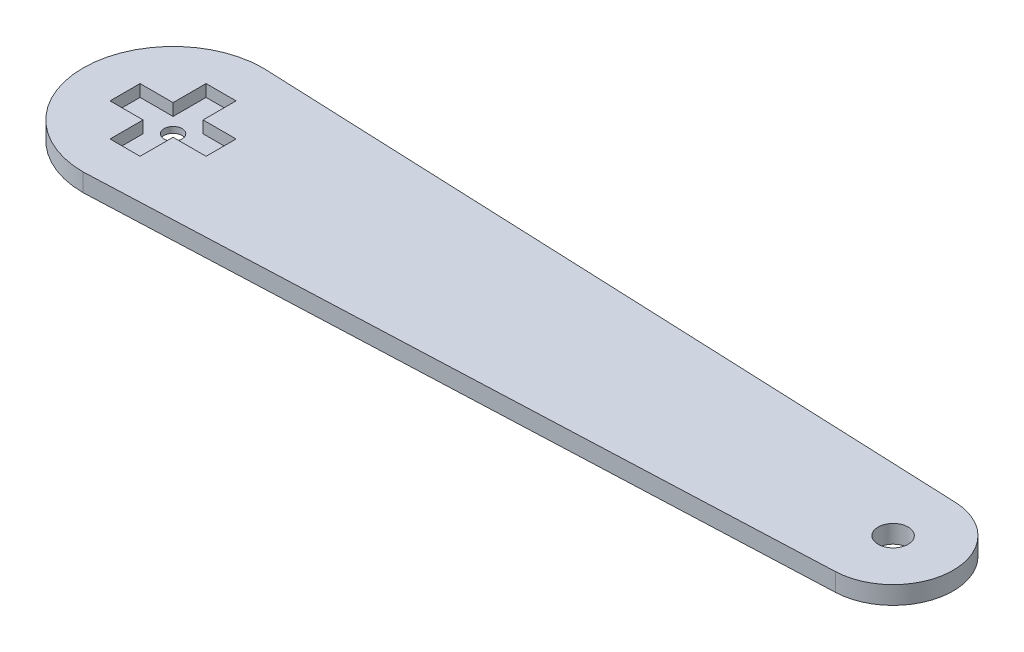
ISO-10303-21;
HEADER;
FILE_DESCRIPTION(('STEP AP214'),'2;1');
FILE_NAME('part.step','',(''),(''),'','','');
FILE_SCHEMA(('AUTOMOTIVE_DESIGN { 1 0 10303 214 1 1 1 1 }'));
ENDSEC;
DATA;
#1=APPLICATION_CONTEXT('core data for automotive mechanical design processes');
#2=APPLICATION_PROTOCOL_DEFINITION('international standard','automotive_design',2000,#1);
#3=PRODUCT_CONTEXT('',#1,'mechanical');
#4=PRODUCT('Part','Part','',(#3));
#5=PRODUCT_RELATED_PRODUCT_CATEGORY('part','',(#4));
#6=PRODUCT_DEFINITION_FORMATION('','',#4);
#7=PRODUCT_DEFINITION_CONTEXT('part definition',#1,'design');
#8=PRODUCT_DEFINITION('design','',#6,#7);
#9=PRODUCT_DEFINITION_SHAPE('','',#8);
#10=(LENGTH_UNIT() NAMED_UNIT(*) SI_UNIT(.MILLI.,.METRE.));
#11=(NAMED_UNIT(*) PLANE_ANGLE_UNIT() SI_UNIT($,.RADIAN.));
#12=(NAMED_UNIT(*) SI_UNIT($,.STERADIAN.) SOLID_ANGLE_UNIT());
#13=UNCERTAINTY_MEASURE_WITH_UNIT(LENGTH_MEASURE(1.E-05),#10,'distance_accuracy_value','');
#14=(GEOMETRIC_REPRESENTATION_CONTEXT(3) GLOBAL_UNCERTAINTY_ASSIGNED_CONTEXT((#13)) GLOBAL_UNIT_ASSIGNED_CONTEXT((#10,
#11,#12)) REPRESENTATION_CONTEXT('',''));
#15=CARTESIAN_POINT('',(0.,0.,0.));
#16=DIRECTION('',(0.,0.,1.));
#17=DIRECTION('',(1.,0.,0.));
#18=AXIS2_PLACEMENT_3D('',#15,#16,#17);
#19=CARTESIAN_POINT('',(0.,3.,0.));
#20=DIRECTION('',(0.,1.,0.));
#21=DIRECTION('',(0.,0.,1.));
#22=AXIS2_PLACEMENT_3D('',#19,#20,#21);
#23=PLANE('',#22);
#24=DIRECTION('',(0.999136065082581,0.,-0.0415586748019892));
#25=VECTOR('',#24,1.);
#26=CARTESIAN_POINT('',(0.622841562175591,3.,14.9740931482305));
#27=LINE('',#26,#25);
#28=CARTESIAN_POINT('',(0.,3.,15.));
#29=VERTEX_POINT('',#28);
#30=CARTESIAN_POINT('',(120.41558674802,3.,9.99136065082581));
#31=VERTEX_POINT('',#30);
#32=EDGE_CURVE('E324',#29,#31,#27,.T.);
#33=ORIENTED_EDGE('',*,*,#32,.T.);
#34=CARTESIAN_POINT('',(120.,3.,0.));
#35=DIRECTION('',(0.,1.,0.));
#36=DIRECTION('',(0.,0.,1.));
#37=AXIS2_PLACEMENT_3D('',#34,#35,#36);
#38=CIRCLE('',#37,10.);
#39=CARTESIAN_POINT('',(120.41558674802,3.,-9.99136065082581));
#40=VERTEX_POINT('',#39);
#41=EDGE_CURVE('E100',#31,#40,#38,.T.);
#42=ORIENTED_EDGE('',*,*,#41,.T.);
#43=DIRECTION('',(0.999136065082581,0.,0.0415586748019892));
#44=VECTOR('',#43,1.);
#45=CARTESIAN_POINT('',(0.622841562175591,3.,-14.9740931482305));
#46=LINE('',#45,#44);
#47=CARTESIAN_POINT('',(0.,3.,-15.));
#48=VERTEX_POINT('',#47);
#49=EDGE_CURVE('E329',#48,#40,#46,.T.);
#50=ORIENTED_EDGE('',*,*,#49,.F.);
#51=CARTESIAN_POINT('',(0.,3.,0.));
#52=DIRECTION('',(0.,1.,0.));
#53=DIRECTION('',(0.,0.,1.));
#54=AXIS2_PLACEMENT_3D('',#51,#52,#53);
#55=CIRCLE('',#54,15.);
#56=EDGE_CURVE('E72',#48,#29,#55,.T.);
#57=ORIENTED_EDGE('',*,*,#56,.T.);
#58=EDGE_LOOP('',(#33,#42,#50,#57));
#59=FACE_BOUND('',#58,.T.);
#60=CARTESIAN_POINT('',(120.,3.,0.));
#61=DIRECTION('',(0.,1.,0.));
#62=DIRECTION('',(0.,0.,1.));
#63=AXIS2_PLACEMENT_3D('',#60,#61,#62);
#64=CIRCLE('',#63,2.5);
#65=CARTESIAN_POINT('',(120.,3.,2.5));
#66=VERTEX_POINT('',#65);
#67=EDGE_CURVE('E315',#66,#66,#64,.T.);
#68=ORIENTED_EDGE('',*,*,#67,.F.);
#69=EDGE_LOOP('',(#68));
#70=FACE_BOUND('',#69,.T.);
#71=DIRECTION('',(1.,0.,0.));
#72=VECTOR('',#71,1.);
#73=CARTESIAN_POINT('',(0.,3.,-2.5));
#74=LINE('',#73,#72);
#75=CARTESIAN_POINT('',(-8.00000000000001,3.,-2.5));
#76=VERTEX_POINT('',#75);
#77=CARTESIAN_POINT('',(-2.50000000000001,3.,-2.5));
#78=VERTEX_POINT('',#77);
#79=EDGE_CURVE('E241',#76,#78,#74,.T.);
#80=ORIENTED_EDGE('',*,*,#79,.T.);
#81=DIRECTION('',(0.,0.,-1.));
#82=VECTOR('',#81,1.);
#83=CARTESIAN_POINT('',(-2.50000000000001,3.,0.));
#84=LINE('',#83,#82);
#85=CARTESIAN_POINT('',(-2.50000000000001,3.,-8.));
#86=VERTEX_POINT('',#85);
#87=EDGE_CURVE('E63',#78,#86,#84,.T.);
#88=ORIENTED_EDGE('',*,*,#87,.T.);
#89=DIRECTION('',(1.,0.,0.));
#90=VECTOR('',#89,1.);
#91=CARTESIAN_POINT('',(0.,3.,-8.));
#92=LINE('',#91,#90);
#93=CARTESIAN_POINT('',(2.49999999999999,3.,-8.));
#94=VERTEX_POINT('',#93);
#95=EDGE_CURVE('E196',#86,#94,#92,.T.);
#96=ORIENTED_EDGE('',*,*,#95,.T.);
#97=DIRECTION('',(0.,0.,-1.));
#98=VECTOR('',#97,1.);
#99=CARTESIAN_POINT('',(2.49999999999999,3.,0.));
#100=LINE('',#99,#98);
#101=CARTESIAN_POINT('',(2.49999999999999,3.,-2.5));
#102=VERTEX_POINT('',#101);
#103=EDGE_CURVE('E200',#102,#94,#100,.T.);
#104=ORIENTED_EDGE('',*,*,#103,.F.);
#105=DIRECTION('',(1.,0.,0.));
#106=VECTOR('',#105,1.);
#107=CARTESIAN_POINT('',(0.,3.,-2.5));
#108=LINE('',#107,#106);
#109=CARTESIAN_POINT('',(7.99999999999999,3.,-2.5));
#110=VERTEX_POINT('',#109);
#111=EDGE_CURVE('E272',#102,#110,#108,.T.);
#112=ORIENTED_EDGE('',*,*,#111,.T.);
#113=DIRECTION('',(0.,0.,-1.));
#114=VECTOR('',#113,1.);
#115=CARTESIAN_POINT('',(7.99999999999999,3.,0.));
#116=LINE('',#115,#114);
#117=CARTESIAN_POINT('',(7.99999999999999,3.,2.5));
#118=VERTEX_POINT('',#117);
#119=EDGE_CURVE('E268',#118,#110,#116,.T.);
#120=ORIENTED_EDGE('',*,*,#119,.F.);
#121=DIRECTION('',(1.,0.,0.));
#122=VECTOR('',#121,1.);
#123=CARTESIAN_POINT('',(0.,3.,2.5));
#124=LINE('',#123,#122);
#125=CARTESIAN_POINT('',(2.49999999999999,3.,2.5));
#126=VERTEX_POINT('',#125);
#127=EDGE_CURVE('E264',#126,#118,#124,.T.);
#128=ORIENTED_EDGE('',*,*,#127,.F.);
#129=DIRECTION('',(0.,0.,-1.));
#130=VECTOR('',#129,1.);
#131=CARTESIAN_POINT('',(2.49999999999999,3.,0.));
#132=LINE('',#131,#130);
#133=CARTESIAN_POINT('',(2.49999999999999,3.,8.));
#134=VERTEX_POINT('',#133);
#135=EDGE_CURVE('E260',#134,#126,#132,.T.);
#136=ORIENTED_EDGE('',*,*,#135,.F.);
#137=DIRECTION('',(1.,0.,0.));
#138=VECTOR('',#137,1.);
#139=CARTESIAN_POINT('',(0.,3.,8.));
#140=LINE('',#139,#138);
#141=CARTESIAN_POINT('',(-2.50000000000001,3.,8.));
#142=VERTEX_POINT('',#141);
#143=EDGE_CURVE('E256',#142,#134,#140,.T.);
#144=ORIENTED_EDGE('',*,*,#143,.F.);
#145=DIRECTION('',(0.,0.,-1.));
#146=VECTOR('',#145,1.);
#147=CARTESIAN_POINT('',(-2.50000000000001,3.,0.));
#148=LINE('',#147,#146);
#149=CARTESIAN_POINT('',(-2.50000000000001,3.,2.5));
#150=VERTEX_POINT('',#149);
#151=EDGE_CURVE('E252',#142,#150,#148,.T.);
#152=ORIENTED_EDGE('',*,*,#151,.T.);
#153=DIRECTION('',(1.,0.,0.));
#154=VECTOR('',#153,1.);
#155=CARTESIAN_POINT('',(0.,3.,2.5));
#156=LINE('',#155,#154);
#157=CARTESIAN_POINT('',(-8.00000000000001,3.,2.5));
#158=VERTEX_POINT('',#157);
#159=EDGE_CURVE('E248',#158,#150,#156,.T.);
#160=ORIENTED_EDGE('',*,*,#159,.F.);
#161=DIRECTION('',(0.,0.,-1.));
#162=VECTOR('',#161,1.);
#163=CARTESIAN_POINT('',(-8.00000000000001,3.,0.));
#164=LINE('',#163,#162);
#165=EDGE_CURVE('E244',#158,#76,#164,.T.);
#166=ORIENTED_EDGE('',*,*,#165,.T.);
#167=EDGE_LOOP('',(#80,#88,#96,#104,#112,#120,#128,#136,#144,#152,#160,#166));
#168=FACE_BOUND('',#167,.T.);
#169=ADVANCED_FACE('F47',(#59,#70,#168),#23,.T.);
#170=CARTESIAN_POINT('',(0.,0.,0.));
#171=DIRECTION('',(0.,1.,0.));
#172=DIRECTION('',(0.,0.,1.));
#173=AXIS2_PLACEMENT_3D('',#170,#171,#172);
#174=CYLINDRICAL_SURFACE('',#173,1.5);
#175=CARTESIAN_POINT('',(0.,0.,0.));
#176=DIRECTION('',(0.,1.,0.));
#177=DIRECTION('',(0.,0.,1.));
#178=AXIS2_PLACEMENT_3D('',#175,#176,#177);
#179=CIRCLE('',#178,1.5);
#180=CARTESIAN_POINT('',(0.,0.,1.5));
#181=VERTEX_POINT('',#180);
#182=EDGE_CURVE('E282',#181,#181,#179,.T.);
#183=ORIENTED_EDGE('',*,*,#182,.F.);
#184=EDGE_LOOP('',(#183));
#185=FACE_BOUND('',#184,.T.);
#186=CARTESIAN_POINT('',(0.,1.,0.));
#187=DIRECTION('',(0.,1.,0.));
#188=DIRECTION('',(0.,0.,1.));
#189=AXIS2_PLACEMENT_3D('',#186,#187,#188);
#190=CIRCLE('',#189,1.5);
#191=CARTESIAN_POINT('',(0.,1.,1.5));
#192=VERTEX_POINT('',#191);
#193=EDGE_CURVE('E189',#192,#192,#190,.F.);
#194=ORIENTED_EDGE('',*,*,#193,.F.);
#195=EDGE_LOOP('',(#194));
#196=FACE_BOUND('',#195,.T.);
#197=ADVANCED_FACE('F367',(#185,#196),#174,.F.);
#198=CARTESIAN_POINT('',(0.622841562175591,3.,14.9740931482305));
#199=DIRECTION('',(-0.0415586748019892,0.,-0.99913606508258));
#200=DIRECTION('',(-0.999136065082581,0.,0.0415586748019892));
#201=AXIS2_PLACEMENT_3D('',#198,#199,#200);
#202=PLANE('',#201);
#203=DIRECTION('',(0.999136065082581,0.,-0.0415586748019892));
#204=VECTOR('',#203,1.);
#205=CARTESIAN_POINT('',(0.622841562175591,0.,14.9740931482305));
#206=LINE('',#205,#204);
#207=CARTESIAN_POINT('',(0.,0.,15.));
#208=VERTEX_POINT('',#207);
#209=CARTESIAN_POINT('',(120.41558674802,0.,9.99136065082581));
#210=VERTEX_POINT('',#209);
#211=EDGE_CURVE('E320',#208,#210,#206,.T.);
#212=ORIENTED_EDGE('',*,*,#211,.T.);
#213=DIRECTION('',(0.,-1.,0.));
#214=VECTOR('',#213,1.);
#215=CARTESIAN_POINT('',(120.41558674802,3.,9.99136065082581));
#216=LINE('',#215,#214);
#217=EDGE_CURVE('E11',#31,#210,#216,.T.);
#218=ORIENTED_EDGE('',*,*,#217,.F.);
#219=ORIENTED_EDGE('',*,*,#32,.F.);
#220=DIRECTION('',(0.,-1.,0.));
#221=VECTOR('',#220,1.);
#222=CARTESIAN_POINT('',(0.,3.,15.));
#223=LINE('',#222,#221);
#224=EDGE_CURVE('E335',#29,#208,#223,.T.);
#225=ORIENTED_EDGE('',*,*,#224,.T.);
#226=EDGE_LOOP('',(#212,#218,#219,#225));
#227=FACE_BOUND('',#226,.T.);
#228=ADVANCED_FACE('F49',(#227),#202,.F.);
#229=CARTESIAN_POINT('',(120.,3.,0.));
#230=DIRECTION('',(0.,-1.,0.));
#231=DIRECTION('',(0.,0.,-1.));
#232=AXIS2_PLACEMENT_3D('',#229,#230,#231);
#233=CYLINDRICAL_SURFACE('',#232,10.);
#234=CARTESIAN_POINT('',(120.,0.,0.));
#235=DIRECTION('',(0.,1.,0.));
#236=DIRECTION('',(0.,0.,1.));
#237=AXIS2_PLACEMENT_3D('',#234,#235,#236);
#238=CIRCLE('',#237,10.);
#239=CARTESIAN_POINT('',(120.41558674802,0.,-9.99136065082581));
#240=VERTEX_POINT('',#239);
#241=EDGE_CURVE('E339',#210,#240,#238,.T.);
#242=ORIENTED_EDGE('',*,*,#241,.T.);
#243=DIRECTION('',(0.,-1.,0.));
#244=VECTOR('',#243,1.);
#245=CARTESIAN_POINT('',(120.41558674802,3.,-9.99136065082581));
#246=LINE('',#245,#244);
#247=EDGE_CURVE('E56',#40,#240,#246,.T.);
#248=ORIENTED_EDGE('',*,*,#247,.F.);
#249=ORIENTED_EDGE('',*,*,#41,.F.);
#250=ORIENTED_EDGE('',*,*,#217,.T.);
#251=EDGE_LOOP('',(#242,#248,#249,#250));
#252=FACE_BOUND('',#251,.T.);
#253=ADVANCED_FACE('F357',(#252),#233,.T.);
#254=CARTESIAN_POINT('',(0.622841562175591,3.,-14.9740931482305));
#255=DIRECTION('',(0.0415586748019892,0.,-0.99913606508258));
#256=DIRECTION('',(-0.999136065082581,0.,-0.0415586748019892));
#257=AXIS2_PLACEMENT_3D('',#254,#255,#256);
#258=PLANE('',#257);
#259=DIRECTION('',(0.999136065082581,0.,0.0415586748019892));
#260=VECTOR('',#259,1.);
#261=CARTESIAN_POINT('',(0.622841562175591,0.,-14.9740931482305));
#262=LINE('',#261,#260);
#263=CARTESIAN_POINT('',(0.,0.,-15.));
#264=VERTEX_POINT('',#263);
#265=EDGE_CURVE('E343',#264,#240,#262,.T.);
#266=ORIENTED_EDGE('',*,*,#265,.F.);
#267=DIRECTION('',(0.,-1.,0.));
#268=VECTOR('',#267,1.);
#269=CARTESIAN_POINT('',(0.,3.,-15.));
#270=LINE('',#269,#268);
#271=EDGE_CURVE('E351',#48,#264,#270,.T.);
#272=ORIENTED_EDGE('',*,*,#271,.F.);
#273=ORIENTED_EDGE('',*,*,#49,.T.);
#274=ORIENTED_EDGE('',*,*,#247,.T.);
#275=EDGE_LOOP('',(#266,#272,#273,#274));
#276=FACE_BOUND('',#275,.T.);
#277=ADVANCED_FACE('F356',(#276),#258,.T.);
#278=CARTESIAN_POINT('',(0.,3.,0.));
#279=DIRECTION('',(0.,-1.,0.));
#280=DIRECTION('',(0.,0.,-1.));
#281=AXIS2_PLACEMENT_3D('',#278,#279,#280);
#282=CYLINDRICAL_SURFACE('',#281,15.);
#283=CARTESIAN_POINT('',(0.,0.,0.));
#284=DIRECTION('',(0.,1.,0.));
#285=DIRECTION('',(0.,0.,1.));
#286=AXIS2_PLACEMENT_3D('',#283,#284,#285);
#287=CIRCLE('',#286,15.);
#288=EDGE_CURVE('E93',#264,#208,#287,.T.);
#289=ORIENTED_EDGE('',*,*,#288,.T.);
#290=ORIENTED_EDGE('',*,*,#224,.F.);
#291=ORIENTED_EDGE('',*,*,#56,.F.);
#292=ORIENTED_EDGE('',*,*,#271,.T.);
#293=EDGE_LOOP('',(#289,#290,#291,#292));
#294=FACE_BOUND('',#293,.T.);
#295=ADVANCED_FACE('F364',(#294),#282,.T.);
#296=CARTESIAN_POINT('',(0.,0.,0.));
#297=DIRECTION('',(0.,1.,0.));
#298=DIRECTION('',(0.,0.,1.));
#299=AXIS2_PLACEMENT_3D('',#296,#297,#298);
#300=PLANE('',#299);
#301=ORIENTED_EDGE('',*,*,#182,.T.);
#302=EDGE_LOOP('',(#301));
#303=FACE_BOUND('',#302,.T.);
#304=CARTESIAN_POINT('',(120.,0.,0.));
#305=DIRECTION('',(0.,1.,0.));
#306=DIRECTION('',(0.,0.,1.));
#307=AXIS2_PLACEMENT_3D('',#304,#305,#306);
#308=CIRCLE('',#307,2.5);
#309=CARTESIAN_POINT('',(120.,0.,2.5));
#310=VERTEX_POINT('',#309);
#311=EDGE_CURVE('E316',#310,#310,#308,.T.);
#312=ORIENTED_EDGE('',*,*,#311,.T.);
#313=EDGE_LOOP('',(#312));
#314=FACE_BOUND('',#313,.T.);
#315=ORIENTED_EDGE('',*,*,#211,.F.);
#316=ORIENTED_EDGE('',*,*,#288,.F.);
#317=ORIENTED_EDGE('',*,*,#265,.T.);
#318=ORIENTED_EDGE('',*,*,#241,.F.);
#319=EDGE_LOOP('',(#315,#316,#317,#318));
#320=FACE_BOUND('',#319,.T.);
#321=ADVANCED_FACE('F361',(#303,#314,#320),#300,.F.);
#322=CARTESIAN_POINT('',(120.,0.,0.));
#323=DIRECTION('',(0.,1.,0.));
#324=DIRECTION('',(0.,0.,1.));
#325=AXIS2_PLACEMENT_3D('',#322,#323,#324);
#326=CYLINDRICAL_SURFACE('',#325,2.5);
#327=ORIENTED_EDGE('',*,*,#311,.F.);
#328=EDGE_LOOP('',(#327));
#329=FACE_BOUND('',#328,.T.);
#330=ORIENTED_EDGE('',*,*,#67,.T.);
#331=EDGE_LOOP('',(#330));
#332=FACE_BOUND('',#331,.T.);
#333=ADVANCED_FACE('F418',(#329,#332),#326,.F.);
#334=CARTESIAN_POINT('',(-2.50000000000001,1.,0.));
#335=DIRECTION('',(1.,0.,0.));
#336=DIRECTION('',(0.,0.,-1.));
#337=AXIS2_PLACEMENT_3D('',#334,#335,#336);
#338=PLANE('',#337);
#339=ORIENTED_EDGE('',*,*,#87,.F.);
#340=DIRECTION('',(0.,1.,0.));
#341=VECTOR('',#340,1.);
#342=CARTESIAN_POINT('',(-2.50000000000001,1.,-2.5));
#343=LINE('',#342,#341);
#344=CARTESIAN_POINT('',(-2.50000000000001,1.,-2.5));
#345=VERTEX_POINT('',#344);
#346=EDGE_CURVE('E175',#345,#78,#343,.T.);
#347=ORIENTED_EDGE('',*,*,#346,.F.);
#348=DIRECTION('',(0.,0.,-1.));
#349=VECTOR('',#348,1.);
#350=CARTESIAN_POINT('',(-2.50000000000001,1.,0.));
#351=LINE('',#350,#349);
#352=CARTESIAN_POINT('',(-2.50000000000001,1.,-8.));
#353=VERTEX_POINT('',#352);
#354=EDGE_CURVE('E183',#345,#353,#351,.T.);
#355=ORIENTED_EDGE('',*,*,#354,.T.);
#356=DIRECTION('',(0.,1.,0.));
#357=VECTOR('',#356,1.);
#358=CARTESIAN_POINT('',(-2.50000000000001,1.,-8.));
#359=LINE('',#358,#357);
#360=EDGE_CURVE('E279',#353,#86,#359,.T.);
#361=ORIENTED_EDGE('',*,*,#360,.T.);
#362=EDGE_LOOP('',(#339,#347,#355,#361));
#363=FACE_BOUND('',#362,.T.);
#364=ADVANCED_FACE('F186',(#363),#338,.T.);
#365=CARTESIAN_POINT('',(0.,1.,-8.));
#366=DIRECTION('',(0.,0.,1.));
#367=DIRECTION('',(1.,0.,0.));
#368=AXIS2_PLACEMENT_3D('',#365,#366,#367);
#369=PLANE('',#368);
#370=ORIENTED_EDGE('',*,*,#95,.F.);
#371=ORIENTED_EDGE('',*,*,#360,.F.);
#372=DIRECTION('',(1.,0.,0.));
#373=VECTOR('',#372,1.);
#374=CARTESIAN_POINT('',(0.,1.,-8.));
#375=LINE('',#374,#373);
#376=CARTESIAN_POINT('',(2.49999999999999,1.,-8.));
#377=VERTEX_POINT('',#376);
#378=EDGE_CURVE('E194',#353,#377,#375,.T.);
#379=ORIENTED_EDGE('',*,*,#378,.T.);
#380=DIRECTION('',(0.,1.,0.));
#381=VECTOR('',#380,1.);
#382=CARTESIAN_POINT('',(2.49999999999999,1.,-8.));
#383=LINE('',#382,#381);
#384=EDGE_CURVE('E283',#377,#94,#383,.T.);
#385=ORIENTED_EDGE('',*,*,#384,.T.);
#386=EDGE_LOOP('',(#370,#371,#379,#385));
#387=FACE_BOUND('',#386,.T.);
#388=ADVANCED_FACE('F410',(#387),#369,.T.);
#389=CARTESIAN_POINT('',(2.49999999999999,1.,0.));
#390=DIRECTION('',(1.,0.,0.));
#391=DIRECTION('',(0.,0.,-1.));
#392=AXIS2_PLACEMENT_3D('',#389,#390,#391);
#393=PLANE('',#392);
#394=ORIENTED_EDGE('',*,*,#103,.T.);
#395=ORIENTED_EDGE('',*,*,#384,.F.);
#396=DIRECTION('',(0.,0.,-1.));
#397=VECTOR('',#396,1.);
#398=CARTESIAN_POINT('',(2.49999999999999,1.,0.));
#399=LINE('',#398,#397);
#400=CARTESIAN_POINT('',(2.49999999999999,1.,-2.5));
#401=VERTEX_POINT('',#400);
#402=EDGE_CURVE('E231',#401,#377,#399,.T.);
#403=ORIENTED_EDGE('',*,*,#402,.F.);
#404=DIRECTION('',(0.,1.,0.));
#405=VECTOR('',#404,1.);
#406=CARTESIAN_POINT('',(2.49999999999999,1.,-2.5));
#407=LINE('',#406,#405);
#408=EDGE_CURVE('E286',#401,#102,#407,.T.);
#409=ORIENTED_EDGE('',*,*,#408,.T.);
#410=EDGE_LOOP('',(#394,#395,#403,#409));
#411=FACE_BOUND('',#410,.T.);
#412=ADVANCED_FACE('F408',(#411),#393,.F.);
#413=CARTESIAN_POINT('',(0.,1.,-2.5));
#414=DIRECTION('',(0.,0.,1.));
#415=DIRECTION('',(1.,0.,0.));
#416=AXIS2_PLACEMENT_3D('',#413,#414,#415);
#417=PLANE('',#416);
#418=ORIENTED_EDGE('',*,*,#111,.F.);
#419=ORIENTED_EDGE('',*,*,#408,.F.);
#420=DIRECTION('',(1.,0.,0.));
#421=VECTOR('',#420,1.);
#422=CARTESIAN_POINT('',(0.,1.,-2.5));
#423=LINE('',#422,#421);
#424=CARTESIAN_POINT('',(7.99999999999999,1.,-2.5));
#425=VERTEX_POINT('',#424);
#426=EDGE_CURVE('E228',#401,#425,#423,.T.);
#427=ORIENTED_EDGE('',*,*,#426,.T.);
#428=DIRECTION('',(0.,1.,0.));
#429=VECTOR('',#428,1.);
#430=CARTESIAN_POINT('',(7.99999999999999,1.,-2.5));
#431=LINE('',#430,#429);
#432=EDGE_CURVE('E289',#425,#110,#431,.T.);
#433=ORIENTED_EDGE('',*,*,#432,.T.);
#434=EDGE_LOOP('',(#418,#419,#427,#433));
#435=FACE_BOUND('',#434,.T.);
#436=ADVANCED_FACE('F403',(#435),#417,.T.);
#437=CARTESIAN_POINT('',(7.99999999999999,1.,0.));
#438=DIRECTION('',(1.,0.,0.));
#439=DIRECTION('',(0.,0.,-1.));
#440=AXIS2_PLACEMENT_3D('',#437,#438,#439);
#441=PLANE('',#440);
#442=ORIENTED_EDGE('',*,*,#119,.T.);
#443=ORIENTED_EDGE('',*,*,#432,.F.);
#444=DIRECTION('',(0.,0.,-1.));
#445=VECTOR('',#444,1.);
#446=CARTESIAN_POINT('',(7.99999999999999,1.,0.));
#447=LINE('',#446,#445);
#448=CARTESIAN_POINT('',(7.99999999999999,1.,2.5));
#449=VERTEX_POINT('',#448);
#450=EDGE_CURVE('E224',#449,#425,#447,.T.);
#451=ORIENTED_EDGE('',*,*,#450,.F.);
#452=DIRECTION('',(0.,1.,0.));
#453=VECTOR('',#452,1.);
#454=CARTESIAN_POINT('',(7.99999999999999,1.,2.5));
#455=LINE('',#454,#453);
#456=EDGE_CURVE('E292',#449,#118,#455,.T.);
#457=ORIENTED_EDGE('',*,*,#456,.T.);
#458=EDGE_LOOP('',(#442,#443,#451,#457));
#459=FACE_BOUND('',#458,.T.);
#460=ADVANCED_FACE('F400',(#459),#441,.F.);
#461=CARTESIAN_POINT('',(0.,1.,2.5));
#462=DIRECTION('',(0.,0.,1.));
#463=DIRECTION('',(1.,0.,0.));
#464=AXIS2_PLACEMENT_3D('',#461,#462,#463);
#465=PLANE('',#464);
#466=ORIENTED_EDGE('',*,*,#127,.T.);
#467=ORIENTED_EDGE('',*,*,#456,.F.);
#468=DIRECTION('',(1.,0.,0.));
#469=VECTOR('',#468,1.);
#470=CARTESIAN_POINT('',(0.,1.,2.5));
#471=LINE('',#470,#469);
#472=CARTESIAN_POINT('',(2.49999999999999,1.,2.5));
#473=VERTEX_POINT('',#472);
#474=EDGE_CURVE('E220',#473,#449,#471,.T.);
#475=ORIENTED_EDGE('',*,*,#474,.F.);
#476=DIRECTION('',(0.,1.,0.));
#477=VECTOR('',#476,1.);
#478=CARTESIAN_POINT('',(2.49999999999999,1.,2.5));
#479=LINE('',#478,#477);
#480=EDGE_CURVE('E295',#473,#126,#479,.T.);
#481=ORIENTED_EDGE('',*,*,#480,.T.);
#482=EDGE_LOOP('',(#466,#467,#475,#481));
#483=FACE_BOUND('',#482,.T.);
#484=ADVANCED_FACE('F395',(#483),#465,.F.);
#485=CARTESIAN_POINT('',(2.49999999999999,1.,0.));
#486=DIRECTION('',(1.,0.,0.));
#487=DIRECTION('',(0.,0.,-1.));
#488=AXIS2_PLACEMENT_3D('',#485,#486,#487);
#489=PLANE('',#488);
#490=ORIENTED_EDGE('',*,*,#135,.T.);
#491=ORIENTED_EDGE('',*,*,#480,.F.);
#492=DIRECTION('',(0.,0.,-1.));
#493=VECTOR('',#492,1.);
#494=CARTESIAN_POINT('',(2.49999999999999,1.,0.));
#495=LINE('',#494,#493);
#496=CARTESIAN_POINT('',(2.49999999999999,1.,8.));
#497=VERTEX_POINT('',#496);
#498=EDGE_CURVE('E216',#497,#473,#495,.T.);
#499=ORIENTED_EDGE('',*,*,#498,.F.);
#500=DIRECTION('',(0.,1.,0.));
#501=VECTOR('',#500,1.);
#502=CARTESIAN_POINT('',(2.49999999999999,1.,8.));
#503=LINE('',#502,#501);
#504=EDGE_CURVE('E298',#497,#134,#503,.T.);
#505=ORIENTED_EDGE('',*,*,#504,.T.);
#506=EDGE_LOOP('',(#490,#491,#499,#505));
#507=FACE_BOUND('',#506,.T.);
#508=ADVANCED_FACE('F390',(#507),#489,.F.);
#509=CARTESIAN_POINT('',(0.,1.,8.));
#510=DIRECTION('',(0.,0.,1.));
#511=DIRECTION('',(1.,0.,0.));
#512=AXIS2_PLACEMENT_3D('',#509,#510,#511);
#513=PLANE('',#512);
#514=ORIENTED_EDGE('',*,*,#143,.T.);
#515=ORIENTED_EDGE('',*,*,#504,.F.);
#516=DIRECTION('',(1.,0.,0.));
#517=VECTOR('',#516,1.);
#518=CARTESIAN_POINT('',(0.,1.,8.));
#519=LINE('',#518,#517);
#520=CARTESIAN_POINT('',(-2.50000000000001,1.,8.));
#521=VERTEX_POINT('',#520);
#522=EDGE_CURVE('E212',#521,#497,#519,.T.);
#523=ORIENTED_EDGE('',*,*,#522,.F.);
#524=DIRECTION('',(0.,1.,0.));
#525=VECTOR('',#524,1.);
#526=CARTESIAN_POINT('',(-2.50000000000001,1.,8.));
#527=LINE('',#526,#525);
#528=EDGE_CURVE('E301',#521,#142,#527,.T.);
#529=ORIENTED_EDGE('',*,*,#528,.T.);
#530=EDGE_LOOP('',(#514,#515,#523,#529));
#531=FACE_BOUND('',#530,.T.);
#532=ADVANCED_FACE('F386',(#531),#513,.F.);
#533=CARTESIAN_POINT('',(-2.50000000000001,1.,0.));
#534=DIRECTION('',(1.,0.,0.));
#535=DIRECTION('',(0.,0.,-1.));
#536=AXIS2_PLACEMENT_3D('',#533,#534,#535);
#537=PLANE('',#536);
#538=ORIENTED_EDGE('',*,*,#151,.F.);
#539=ORIENTED_EDGE('',*,*,#528,.F.);
#540=DIRECTION('',(0.,0.,-1.));
#541=VECTOR('',#540,1.);
#542=CARTESIAN_POINT('',(-2.50000000000001,1.,0.));
#543=LINE('',#542,#541);
#544=CARTESIAN_POINT('',(-2.50000000000001,1.,2.5));
#545=VERTEX_POINT('',#544);
#546=EDGE_CURVE('E209',#521,#545,#543,.T.);
#547=ORIENTED_EDGE('',*,*,#546,.T.);
#548=DIRECTION('',(0.,1.,0.));
#549=VECTOR('',#548,1.);
#550=CARTESIAN_POINT('',(-2.50000000000001,1.,2.5));
#551=LINE('',#550,#549);
#552=EDGE_CURVE('E304',#545,#150,#551,.T.);
#553=ORIENTED_EDGE('',*,*,#552,.T.);
#554=EDGE_LOOP('',(#538,#539,#547,#553));
#555=FACE_BOUND('',#554,.T.);
#556=ADVANCED_FACE('F382',(#555),#537,.T.);
#557=CARTESIAN_POINT('',(0.,1.,2.5));
#558=DIRECTION('',(0.,0.,1.));
#559=DIRECTION('',(1.,0.,0.));
#560=AXIS2_PLACEMENT_3D('',#557,#558,#559);
#561=PLANE('',#560);
#562=ORIENTED_EDGE('',*,*,#159,.T.);
#563=ORIENTED_EDGE('',*,*,#552,.F.);
#564=DIRECTION('',(1.,0.,0.));
#565=VECTOR('',#564,1.);
#566=CARTESIAN_POINT('',(0.,1.,2.5));
#567=LINE('',#566,#565);
#568=CARTESIAN_POINT('',(-8.00000000000001,1.,2.5));
#569=VERTEX_POINT('',#568);
#570=EDGE_CURVE('E205',#569,#545,#567,.T.);
#571=ORIENTED_EDGE('',*,*,#570,.F.);
#572=DIRECTION('',(0.,1.,0.));
#573=VECTOR('',#572,1.);
#574=CARTESIAN_POINT('',(-8.00000000000001,1.,2.5));
#575=LINE('',#574,#573);
#576=EDGE_CURVE('E307',#569,#158,#575,.T.);
#577=ORIENTED_EDGE('',*,*,#576,.T.);
#578=EDGE_LOOP('',(#562,#563,#571,#577));
#579=FACE_BOUND('',#578,.T.);
#580=ADVANCED_FACE('F379',(#579),#561,.F.);
#581=CARTESIAN_POINT('',(-8.00000000000001,1.,0.));
#582=DIRECTION('',(1.,0.,0.));
#583=DIRECTION('',(0.,0.,-1.));
#584=AXIS2_PLACEMENT_3D('',#581,#582,#583);
#585=PLANE('',#584);
#586=ORIENTED_EDGE('',*,*,#165,.F.);
#587=ORIENTED_EDGE('',*,*,#576,.F.);
#588=DIRECTION('',(0.,0.,-1.));
#589=VECTOR('',#588,1.);
#590=CARTESIAN_POINT('',(-8.00000000000001,1.,0.));
#591=LINE('',#590,#589);
#592=CARTESIAN_POINT('',(-8.00000000000001,1.,-2.5));
#593=VERTEX_POINT('',#592);
#594=EDGE_CURVE('E182',#569,#593,#591,.T.);
#595=ORIENTED_EDGE('',*,*,#594,.T.);
#596=DIRECTION('',(0.,1.,0.));
#597=VECTOR('',#596,1.);
#598=CARTESIAN_POINT('',(-8.00000000000001,1.,-2.5));
#599=LINE('',#598,#597);
#600=EDGE_CURVE('E177',#593,#76,#599,.T.);
#601=ORIENTED_EDGE('',*,*,#600,.T.);
#602=EDGE_LOOP('',(#586,#587,#595,#601));
#603=FACE_BOUND('',#602,.T.);
#604=ADVANCED_FACE('F374',(#603),#585,.T.);
#605=CARTESIAN_POINT('',(0.,1.,-2.5));
#606=DIRECTION('',(0.,0.,1.));
#607=DIRECTION('',(1.,0.,0.));
#608=AXIS2_PLACEMENT_3D('',#605,#606,#607);
#609=PLANE('',#608);
#610=ORIENTED_EDGE('',*,*,#79,.F.);
#611=ORIENTED_EDGE('',*,*,#600,.F.);
#612=DIRECTION('',(1.,0.,0.));
#613=VECTOR('',#612,1.);
#614=CARTESIAN_POINT('',(0.,1.,-2.5));
#615=LINE('',#614,#613);
#616=EDGE_CURVE('E172',#593,#345,#615,.T.);
#617=ORIENTED_EDGE('',*,*,#616,.T.);
#618=ORIENTED_EDGE('',*,*,#346,.T.);
#619=EDGE_LOOP('',(#610,#611,#617,#618));
#620=FACE_BOUND('',#619,.T.);
#621=ADVANCED_FACE('F174',(#620),#609,.T.);
#622=CARTESIAN_POINT('',(0.,1.,0.));
#623=DIRECTION('',(0.,1.,0.));
#624=DIRECTION('',(0.,0.,1.));
#625=AXIS2_PLACEMENT_3D('',#622,#623,#624);
#626=PLANE('',#625);
#627=ORIENTED_EDGE('',*,*,#354,.F.);
#628=ORIENTED_EDGE('',*,*,#616,.F.);
#629=ORIENTED_EDGE('',*,*,#594,.F.);
#630=ORIENTED_EDGE('',*,*,#570,.T.);
#631=ORIENTED_EDGE('',*,*,#546,.F.);
#632=ORIENTED_EDGE('',*,*,#522,.T.);
#633=ORIENTED_EDGE('',*,*,#498,.T.);
#634=ORIENTED_EDGE('',*,*,#474,.T.);
#635=ORIENTED_EDGE('',*,*,#450,.T.);
#636=ORIENTED_EDGE('',*,*,#426,.F.);
#637=ORIENTED_EDGE('',*,*,#402,.T.);
#638=ORIENTED_EDGE('',*,*,#378,.F.);
#639=EDGE_LOOP('',(#627,#628,#629,#630,#631,#632,#633,#634,#635,#636,#637,#638));
#640=FACE_BOUND('',#639,.T.);
#641=ORIENTED_EDGE('',*,*,#193,.T.);
#642=EDGE_LOOP('',(#641));
#643=FACE_BOUND('',#642,.T.);
#644=ADVANCED_FACE('F191',(#640,#643),#626,.T.);
#645=CLOSED_SHELL('',(#169,#197,#228,#253,#277,#295,#321,#333,#364,#388,#412,#436,#460,#484,
#508,#532,#556,#580,#604,#621,#644));
#646=MANIFOLD_SOLID_BREP('B2',#645);
#647=ADVANCED_BREP_SHAPE_REPRESENTATION('',(#18,#646),#14);
#648=SHAPE_DEFINITION_REPRESENTATION(#9,#647);
ENDSEC;
END-ISO-10303-21;
